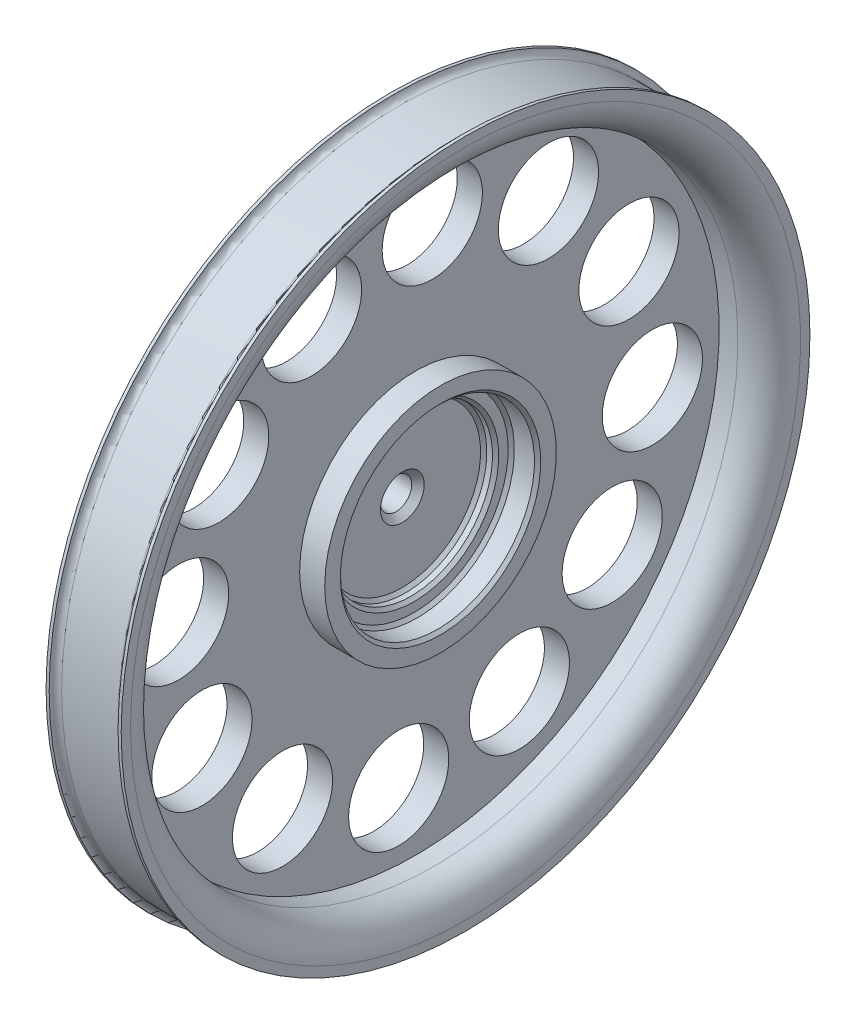
ISO-10303-21;
HEADER;
FILE_DESCRIPTION(('STEP AP214'),'2;1');
FILE_NAME('part.step','',(''),(''),'','','');
FILE_SCHEMA(('AUTOMOTIVE_DESIGN { 1 0 10303 214 1 1 1 1 }'));
ENDSEC;
DATA;
#1=APPLICATION_CONTEXT('core data for automotive mechanical design processes');
#2=APPLICATION_PROTOCOL_DEFINITION('international standard','automotive_design',2000,#1);
#3=PRODUCT_CONTEXT('',#1,'mechanical');
#4=PRODUCT('Part','Part','',(#3));
#5=PRODUCT_RELATED_PRODUCT_CATEGORY('part','',(#4));
#6=PRODUCT_DEFINITION_FORMATION('','',#4);
#7=PRODUCT_DEFINITION_CONTEXT('part definition',#1,'design');
#8=PRODUCT_DEFINITION('design','',#6,#7);
#9=PRODUCT_DEFINITION_SHAPE('','',#8);
#10=(LENGTH_UNIT() NAMED_UNIT(*) SI_UNIT(.MILLI.,.METRE.));
#11=(NAMED_UNIT(*) PLANE_ANGLE_UNIT() SI_UNIT($,.RADIAN.));
#12=(NAMED_UNIT(*) SI_UNIT($,.STERADIAN.) SOLID_ANGLE_UNIT());
#13=UNCERTAINTY_MEASURE_WITH_UNIT(LENGTH_MEASURE(1.E-05),#10,'distance_accuracy_value','');
#14=(GEOMETRIC_REPRESENTATION_CONTEXT(3) GLOBAL_UNCERTAINTY_ASSIGNED_CONTEXT((#13)) GLOBAL_UNIT_ASSIGNED_CONTEXT((#10,
#11,#12)) REPRESENTATION_CONTEXT('',''));
#15=CARTESIAN_POINT('',(0.,0.,0.));
#16=DIRECTION('',(0.,0.,1.));
#17=DIRECTION('',(1.,0.,0.));
#18=AXIS2_PLACEMENT_3D('',#15,#16,#17);
#19=CARTESIAN_POINT('',(-3.99999999999999,-8.9217552513851,0.));
#20=DIRECTION('',(-1.,0.,0.));
#21=DIRECTION('',(0.,0.,1.));
#22=AXIS2_PLACEMENT_3D('',#19,#20,#21);
#23=PLANE('',#22);
#24=CARTESIAN_POINT('',(-3.99999999999999,-27.4217552513851,0.));
#25=DIRECTION('',(-1.,0.,0.));
#26=DIRECTION('',(0.,0.,1.));
#27=AXIS2_PLACEMENT_3D('',#24,#25,#26);
#28=CIRCLE('',#27,16.);
#29=CARTESIAN_POINT('',(-3.99999999999999,-27.4217552513851,16.));
#30=VERTEX_POINT('',#29);
#31=EDGE_CURVE('E10',#30,#30,#28,.T.);
#32=ORIENTED_EDGE('',*,*,#31,.T.);
#33=EDGE_LOOP('',(#32));
#34=FACE_BOUND('',#33,.T.);
#35=CARTESIAN_POINT('',(-4.,-27.4217552513851,0.));
#36=DIRECTION('',(-1.,0.,0.));
#37=DIRECTION('',(0.,0.,1.));
#38=AXIS2_PLACEMENT_3D('',#35,#36,#37);
#39=CIRCLE('',#38,18.5);
#40=CARTESIAN_POINT('',(-4.,-27.4217552513851,18.5));
#41=VERTEX_POINT('',#40);
#42=EDGE_CURVE('E93',#41,#41,#39,.T.);
#43=ORIENTED_EDGE('',*,*,#42,.F.);
#44=EDGE_LOOP('',(#43));
#45=FACE_BOUND('',#44,.T.);
#46=ADVANCED_FACE('F31',(#34,#45),#23,.F.);
#47=CARTESIAN_POINT('',(-20.1,-27.4217552513851,0.));
#48=DIRECTION('',(-1.,0.,0.));
#49=DIRECTION('',(0.,0.,1.));
#50=AXIS2_PLACEMENT_3D('',#47,#48,#49);
#51=CYLINDRICAL_SURFACE('',#50,18.5);
#52=CARTESIAN_POINT('',(-7.99999999999999,-27.4217552513851,0.));
#53=DIRECTION('',(-1.,0.,0.));
#54=DIRECTION('',(0.,0.,1.));
#55=AXIS2_PLACEMENT_3D('',#52,#53,#54);
#56=CIRCLE('',#55,18.5);
#57=CARTESIAN_POINT('',(-7.99999999999999,-27.4217552513851,18.5));
#58=VERTEX_POINT('',#57);
#59=EDGE_CURVE('E96',#58,#58,#56,.T.);
#60=ORIENTED_EDGE('',*,*,#59,.F.);
#61=EDGE_LOOP('',(#60));
#62=FACE_BOUND('',#61,.T.);
#63=ORIENTED_EDGE('',*,*,#42,.T.);
#64=EDGE_LOOP('',(#63));
#65=FACE_BOUND('',#64,.T.);
#66=ADVANCED_FACE('F254',(#62,#65),#51,.T.);
#67=CARTESIAN_POINT('',(-8.,21.0782447486149,0.));
#68=DIRECTION('',(-1.,0.,0.));
#69=DIRECTION('',(0.,0.,1.));
#70=AXIS2_PLACEMENT_3D('',#67,#68,#69);
#71=PLANE('',#70);
#72=CARTESIAN_POINT('',(-8.,-10.8282369676647,-34.1012852833971));
#73=DIRECTION('',(-1.,0.,0.));
#74=DIRECTION('',(0.,0.,1.));
#75=AXIS2_PLACEMENT_3D('',#72,#73,#74);
#76=CIRCLE('',#75,8.);
#77=CARTESIAN_POINT('',(-8.,-10.8282369676647,-26.1012852833971));
#78=VERTEX_POINT('',#77);
#79=EDGE_CURVE('E120',#78,#78,#76,.T.);
#80=ORIENTED_EDGE('',*,*,#79,.T.);
#81=EDGE_LOOP('',(#80));
#82=FACE_BOUND('',#81,.T.);
#83=CARTESIAN_POINT('',(-8.,3.99929576217611,-21.2358202152591));
#84=DIRECTION('',(-1.,0.,0.));
#85=DIRECTION('',(0.,0.,1.));
#86=AXIS2_PLACEMENT_3D('',#83,#84,#85);
#87=CIRCLE('',#86,8.);
#88=CARTESIAN_POINT('',(-8.,3.99929576217611,-13.2358202152592));
#89=VERTEX_POINT('',#88);
#90=EDGE_CURVE('E123',#89,#89,#87,.T.);
#91=ORIENTED_EDGE('',*,*,#90,.T.);
#92=EDGE_LOOP('',(#91));
#93=FACE_BOUND('',#92,.T.);
#94=CARTESIAN_POINT('',(-8.,-30.1019895212211,-37.8293384989855));
#95=DIRECTION('',(-1.,0.,0.));
#96=DIRECTION('',(0.,0.,1.));
#97=AXIS2_PLACEMENT_3D('',#94,#95,#96);
#98=CIRCLE('',#97,7.99999999999999);
#99=CARTESIAN_POINT('',(-8.,-30.1019895212211,-29.8293384989855));
#100=VERTEX_POINT('',#99);
#101=EDGE_CURVE('E126',#100,#100,#98,.T.);
#102=ORIENTED_EDGE('',*,*,#101,.T.);
#103=EDGE_LOOP('',(#102));
#104=FACE_BOUND('',#103,.T.);
#105=CARTESIAN_POINT('',(-8.,-48.6575754666503,-31.4210510135672));
#106=DIRECTION('',(-1.,0.,0.));
#107=DIRECTION('',(0.,0.,1.));
#108=AXIS2_PLACEMENT_3D('',#105,#106,#107);
#109=CIRCLE('',#108,8.);
#110=CARTESIAN_POINT('',(-8.,-48.6575754666503,-23.4210510135672));
#111=VERTEX_POINT('',#110);
#112=EDGE_CURVE('E129',#111,#111,#109,.T.);
#113=ORIENTED_EDGE('',*,*,#112,.T.);
#114=EDGE_LOOP('',(#113));
#115=FACE_BOUND('',#114,.T.);
#116=CARTESIAN_POINT('',(-8.,-61.5230405347883,-16.5935182837264));
#117=DIRECTION('',(-1.,0.,0.));
#118=DIRECTION('',(0.,0.,1.));
#119=AXIS2_PLACEMENT_3D('',#116,#117,#118);
#120=CIRCLE('',#119,8.00000000000001);
#121=CARTESIAN_POINT('',(-8.,-61.5230405347883,-8.59351828372635));
#122=VERTEX_POINT('',#121);
#123=EDGE_CURVE('E132',#122,#122,#120,.T.);
#124=ORIENTED_EDGE('',*,*,#123,.T.);
#125=EDGE_LOOP('',(#124));
#126=FACE_BOUND('',#125,.T.);
#127=CARTESIAN_POINT('',(-8.,-65.2510937503767,2.68023426983001));
#128=DIRECTION('',(-1.,0.,0.));
#129=DIRECTION('',(0.,0.,1.));
#130=AXIS2_PLACEMENT_3D('',#127,#128,#129);
#131=CIRCLE('',#130,8.00000000000001);
#132=CARTESIAN_POINT('',(-8.,-65.2510937503767,10.68023426983));
#133=VERTEX_POINT('',#132);
#134=EDGE_CURVE('E135',#133,#133,#131,.T.);
#135=ORIENTED_EDGE('',*,*,#134,.T.);
#136=EDGE_LOOP('',(#135));
#137=FACE_BOUND('',#136,.T.);
#138=CARTESIAN_POINT('',(-8.,-44.0152735351175,34.1012852833972));
#139=DIRECTION('',(-1.,0.,0.));
#140=DIRECTION('',(0.,0.,1.));
#141=AXIS2_PLACEMENT_3D('',#138,#139,#140);
#142=CIRCLE('',#141,8.);
#143=CARTESIAN_POINT('',(-8.,-44.0152735351175,42.1012852833972));
#144=VERTEX_POINT('',#143);
#145=EDGE_CURVE('E138',#144,#144,#142,.T.);
#146=ORIENTED_EDGE('',*,*,#145,.T.);
#147=EDGE_LOOP('',(#146));
#148=FACE_BOUND('',#147,.T.);
#149=CARTESIAN_POINT('',(-8.,-58.8428062649583,21.2358202152592));
#150=DIRECTION('',(-1.,0.,0.));
#151=DIRECTION('',(0.,0.,1.));
#152=AXIS2_PLACEMENT_3D('',#149,#150,#151);
#153=CIRCLE('',#152,8.);
#154=CARTESIAN_POINT('',(-8.,-58.8428062649583,29.2358202152592));
#155=VERTEX_POINT('',#154);
#156=EDGE_CURVE('E141',#155,#155,#153,.T.);
#157=ORIENTED_EDGE('',*,*,#156,.T.);
#158=EDGE_LOOP('',(#157));
#159=FACE_BOUND('',#158,.T.);
#160=CARTESIAN_POINT('',(-8.,-6.1859350361319,31.4210510135672));
#161=DIRECTION('',(-1.,0.,0.));
#162=DIRECTION('',(0.,0.,1.));
#163=AXIS2_PLACEMENT_3D('',#160,#161,#162);
#164=CIRCLE('',#163,7.99999999999998);
#165=CARTESIAN_POINT('',(-8.,-6.1859350361319,39.4210510135672));
#166=VERTEX_POINT('',#165);
#167=EDGE_CURVE('E144',#166,#166,#164,.T.);
#168=ORIENTED_EDGE('',*,*,#167,.T.);
#169=EDGE_LOOP('',(#168));
#170=FACE_BOUND('',#169,.T.);
#171=CARTESIAN_POINT('',(-8.,6.6795300320061,16.5935182837264));
#172=DIRECTION('',(-1.,0.,0.));
#173=DIRECTION('',(0.,0.,1.));
#174=AXIS2_PLACEMENT_3D('',#171,#172,#173);
#175=CIRCLE('',#174,8.);
#176=CARTESIAN_POINT('',(-8.,6.6795300320061,24.5935182837264));
#177=VERTEX_POINT('',#176);
#178=EDGE_CURVE('E147',#177,#177,#175,.T.);
#179=ORIENTED_EDGE('',*,*,#178,.T.);
#180=EDGE_LOOP('',(#179));
#181=FACE_BOUND('',#180,.T.);
#182=CARTESIAN_POINT('',(-8.,10.4075832475945,-2.68023426982993));
#183=DIRECTION('',(-1.,0.,0.));
#184=DIRECTION('',(0.,0.,1.));
#185=AXIS2_PLACEMENT_3D('',#182,#183,#184);
#186=CIRCLE('',#185,8.);
#187=CARTESIAN_POINT('',(-8.,10.4075832475945,5.31976573017007));
#188=VERTEX_POINT('',#187);
#189=EDGE_CURVE('E150',#188,#188,#186,.T.);
#190=ORIENTED_EDGE('',*,*,#189,.T.);
#191=EDGE_LOOP('',(#190));
#192=FACE_BOUND('',#191,.T.);
#193=CARTESIAN_POINT('',(-8.,-24.7415209815611,37.8293384989856));
#194=DIRECTION('',(-1.,0.,0.));
#195=DIRECTION('',(0.,0.,1.));
#196=AXIS2_PLACEMENT_3D('',#193,#194,#195);
#197=CIRCLE('',#196,8.);
#198=CARTESIAN_POINT('',(-8.,-24.7415209815611,45.8293384989856));
#199=VERTEX_POINT('',#198);
#200=EDGE_CURVE('E153',#199,#199,#197,.T.);
#201=ORIENTED_EDGE('',*,*,#200,.T.);
#202=EDGE_LOOP('',(#201));
#203=FACE_BOUND('',#202,.T.);
#204=CARTESIAN_POINT('',(-8.,-27.4217552513851,0.));
#205=DIRECTION('',(-1.,0.,0.));
#206=DIRECTION('',(0.,0.,1.));
#207=AXIS2_PLACEMENT_3D('',#204,#205,#206);
#208=CIRCLE('',#207,48.5);
#209=CARTESIAN_POINT('',(-8.,-27.4217552513851,48.5));
#210=VERTEX_POINT('',#209);
#211=EDGE_CURVE('E99',#210,#210,#208,.T.);
#212=ORIENTED_EDGE('',*,*,#211,.F.);
#213=EDGE_LOOP('',(#212));
#214=FACE_BOUND('',#213,.T.);
#215=ORIENTED_EDGE('',*,*,#59,.T.);
#216=EDGE_LOOP('',(#215));
#217=FACE_BOUND('',#216,.T.);
#218=ADVANCED_FACE('F250',(#82,#93,#104,#115,#126,#137,#148,#159,#170,#181,#192,#203,#214,#217),
#71,.F.);
#219=CARTESIAN_POINT('',(-20.1,-27.4217552513851,0.));
#220=DIRECTION('',(-1.,0.,0.));
#221=DIRECTION('',(0.,0.,1.));
#222=AXIS2_PLACEMENT_3D('',#219,#220,#221);
#223=CYLINDRICAL_SURFACE('',#222,48.5);
#224=CARTESIAN_POINT('',(-5.,-27.4217552513851,0.));
#225=DIRECTION('',(-1.,0.,0.));
#226=DIRECTION('',(0.,0.,1.));
#227=AXIS2_PLACEMENT_3D('',#224,#225,#226);
#228=CIRCLE('',#227,48.5);
#229=CARTESIAN_POINT('',(-5.,-27.4217552513851,48.5));
#230=VERTEX_POINT('',#229);
#231=EDGE_CURVE('E75',#230,#230,#228,.F.);
#232=ORIENTED_EDGE('',*,*,#231,.T.);
#233=EDGE_LOOP('',(#232));
#234=FACE_BOUND('',#233,.T.);
#235=ORIENTED_EDGE('',*,*,#211,.T.);
#236=EDGE_LOOP('',(#235));
#237=FACE_BOUND('',#236,.T.);
#238=ADVANCED_FACE('F244',(#234,#237),#223,.F.);
#239=CARTESIAN_POINT('',(0.,27.5782447486149,0.));
#240=DIRECTION('',(-1.,0.,0.));
#241=DIRECTION('',(0.,0.,1.));
#242=AXIS2_PLACEMENT_3D('',#239,#240,#241);
#243=PLANE('',#242);
#244=CARTESIAN_POINT('',(0.,-27.4217552513851,0.));
#245=DIRECTION('',(-1.,0.,0.));
#246=DIRECTION('',(0.,0.,1.));
#247=AXIS2_PLACEMENT_3D('',#244,#245,#246);
#248=CIRCLE('',#247,53.5);
#249=CARTESIAN_POINT('',(0.,-27.4217552513851,53.5));
#250=VERTEX_POINT('',#249);
#251=EDGE_CURVE('E78',#250,#250,#248,.T.);
#252=ORIENTED_EDGE('',*,*,#251,.T.);
#253=EDGE_LOOP('',(#252));
#254=FACE_BOUND('',#253,.T.);
#255=CARTESIAN_POINT('',(0.,-27.4217552513851,0.));
#256=DIRECTION('',(-1.,0.,0.));
#257=DIRECTION('',(0.,0.,1.));
#258=AXIS2_PLACEMENT_3D('',#255,#256,#257);
#259=CIRCLE('',#258,55.);
#260=CARTESIAN_POINT('',(0.,-27.4217552513851,55.));
#261=VERTEX_POINT('',#260);
#262=EDGE_CURVE('E102',#261,#261,#259,.T.);
#263=ORIENTED_EDGE('',*,*,#262,.F.);
#264=EDGE_LOOP('',(#263));
#265=FACE_BOUND('',#264,.T.);
#266=ADVANCED_FACE('F239',(#254,#265),#243,.F.);
#267=CARTESIAN_POINT('',(-20.1,-27.4217552513851,0.));
#268=DIRECTION('',(-1.,0.,0.));
#269=DIRECTION('',(0.,0.,1.));
#270=AXIS2_PLACEMENT_3D('',#267,#268,#269);
#271=CYLINDRICAL_SURFACE('',#270,55.);
#272=CARTESIAN_POINT('',(-0.5,-27.4217552513851,0.));
#273=DIRECTION('',(-1.,0.,0.));
#274=DIRECTION('',(0.,0.,1.));
#275=AXIS2_PLACEMENT_3D('',#272,#273,#274);
#276=CIRCLE('',#275,55.);
#277=CARTESIAN_POINT('',(-0.5,-27.4217552513851,55.));
#278=VERTEX_POINT('',#277);
#279=EDGE_CURVE('E105',#278,#278,#276,.T.);
#280=ORIENTED_EDGE('',*,*,#279,.F.);
#281=EDGE_LOOP('',(#280));
#282=FACE_BOUND('',#281,.T.);
#283=ORIENTED_EDGE('',*,*,#262,.T.);
#284=EDGE_LOOP('',(#283));
#285=FACE_BOUND('',#284,.T.);
#286=ADVANCED_FACE('F233',(#282,#285),#271,.T.);
#287=CARTESIAN_POINT('',(-1.49999621102573,-27.4217552513851,0.));
#288=DIRECTION('',(-1.,0.,0.));
#289=DIRECTION('',(0.,0.,1.));
#290=AXIS2_PLACEMENT_3D('',#287,#288,#289);
#291=TOROIDAL_SURFACE('',#290,55.0027528047848,1.);
#292=CARTESIAN_POINT('',(-1.49895959557697,-27.4217552513851,0.));
#293=DIRECTION('',(-1.,0.,0.));
#294=DIRECTION('',(0.,0.,1.));
#295=AXIS2_PLACEMENT_3D('',#292,#293,#294);
#296=CIRCLE('',#295,54.0027533420708);
#297=CARTESIAN_POINT('',(-1.49895959557697,-27.4217552513851,54.0027533420708));
#298=VERTEX_POINT('',#297);
#299=EDGE_CURVE('E108',#298,#298,#296,.T.);
#300=ORIENTED_EDGE('',*,*,#299,.F.);
#301=EDGE_LOOP('',(#300));
#302=FACE_BOUND('',#301,.T.);
#303=ORIENTED_EDGE('',*,*,#279,.T.);
#304=EDGE_LOOP('',(#303));
#305=FACE_BOUND('',#304,.T.);
#306=ADVANCED_FACE('F227',(#302,#305),#291,.F.);
#307=CARTESIAN_POINT('',(-20.1,-27.4217552513851,0.));
#308=DIRECTION('',(-1.,0.,0.));
#309=DIRECTION('',(0.,0.,1.));
#310=AXIS2_PLACEMENT_3D('',#307,#308,#309);
#311=CYLINDRICAL_SURFACE('',#310,54.0027533420708);
#312=CARTESIAN_POINT('',(-10.5048742847296,-27.4217552513851,0.));
#313=DIRECTION('',(-1.,0.,0.));
#314=DIRECTION('',(0.,0.,1.));
#315=AXIS2_PLACEMENT_3D('',#312,#313,#314);
#316=CIRCLE('',#315,54.0027533420708);
#317=CARTESIAN_POINT('',(-10.5048742847296,-27.4217552513851,54.0027533420708));
#318=VERTEX_POINT('',#317);
#319=EDGE_CURVE('E111',#318,#318,#316,.T.);
#320=ORIENTED_EDGE('',*,*,#319,.F.);
#321=EDGE_LOOP('',(#320));
#322=FACE_BOUND('',#321,.T.);
#323=ORIENTED_EDGE('',*,*,#299,.T.);
#324=EDGE_LOOP('',(#323));
#325=FACE_BOUND('',#324,.T.);
#326=ADVANCED_FACE('F221',(#322,#325),#311,.T.);
#327=CARTESIAN_POINT('',(-10.5000037578661,-27.4217552513851,0.));
#328=DIRECTION('',(-1.,0.,0.));
#329=DIRECTION('',(0.,0.,1.));
#330=AXIS2_PLACEMENT_3D('',#327,#328,#329);
#331=TOROIDAL_SURFACE('',#330,55.0027414809845,1.);
#332=CARTESIAN_POINT('',(-11.5,-27.4217552513851,0.));
#333=DIRECTION('',(-1.,0.,0.));
#334=DIRECTION('',(0.,0.,1.));
#335=AXIS2_PLACEMENT_3D('',#332,#333,#334);
#336=CIRCLE('',#335,55.);
#337=CARTESIAN_POINT('',(-11.5,-27.4217552513851,55.));
#338=VERTEX_POINT('',#337);
#339=EDGE_CURVE('E114',#338,#338,#336,.T.);
#340=ORIENTED_EDGE('',*,*,#339,.F.);
#341=EDGE_LOOP('',(#340));
#342=FACE_BOUND('',#341,.T.);
#343=ORIENTED_EDGE('',*,*,#319,.T.);
#344=EDGE_LOOP('',(#343));
#345=FACE_BOUND('',#344,.T.);
#346=ADVANCED_FACE('F215',(#342,#345),#331,.F.);
#347=CARTESIAN_POINT('',(-20.1,-27.4217552513851,0.));
#348=DIRECTION('',(-1.,0.,0.));
#349=DIRECTION('',(0.,0.,1.));
#350=AXIS2_PLACEMENT_3D('',#347,#348,#349);
#351=CYLINDRICAL_SURFACE('',#350,55.);
#352=CARTESIAN_POINT('',(-12.,-27.4217552513851,0.));
#353=DIRECTION('',(-1.,0.,0.));
#354=DIRECTION('',(0.,0.,1.));
#355=AXIS2_PLACEMENT_3D('',#352,#353,#354);
#356=CIRCLE('',#355,55.);
#357=CARTESIAN_POINT('',(-12.,-27.4217552513851,55.));
#358=VERTEX_POINT('',#357);
#359=EDGE_CURVE('E117',#358,#358,#356,.T.);
#360=ORIENTED_EDGE('',*,*,#359,.F.);
#361=EDGE_LOOP('',(#360));
#362=FACE_BOUND('',#361,.T.);
#363=ORIENTED_EDGE('',*,*,#339,.T.);
#364=EDGE_LOOP('',(#363));
#365=FACE_BOUND('',#364,.T.);
#366=ADVANCED_FACE('F200',(#362,#365),#351,.T.);
#367=CARTESIAN_POINT('',(-12.,27.5782447486149,0.));
#368=DIRECTION('',(1.,0.,0.));
#369=DIRECTION('',(0.,0.,-1.));
#370=AXIS2_PLACEMENT_3D('',#367,#368,#369);
#371=PLANE('',#370);
#372=CARTESIAN_POINT('',(-12.,-10.8282369676647,-34.1012852833971));
#373=DIRECTION('',(-1.,0.,0.));
#374=DIRECTION('',(0.,0.,1.));
#375=AXIS2_PLACEMENT_3D('',#372,#373,#374);
#376=CIRCLE('',#375,8.);
#377=CARTESIAN_POINT('',(-12.,-10.8282369676647,-26.1012852833971));
#378=VERTEX_POINT('',#377);
#379=EDGE_CURVE('E172',#378,#378,#376,.T.);
#380=ORIENTED_EDGE('',*,*,#379,.F.);
#381=EDGE_LOOP('',(#380));
#382=FACE_BOUND('',#381,.T.);
#383=CARTESIAN_POINT('',(-12.,3.99929576217611,-21.2358202152591));
#384=DIRECTION('',(-1.,0.,0.));
#385=DIRECTION('',(0.,0.,1.));
#386=AXIS2_PLACEMENT_3D('',#383,#384,#385);
#387=CIRCLE('',#386,8.);
#388=CARTESIAN_POINT('',(-12.,3.99929576217611,-13.2358202152592));
#389=VERTEX_POINT('',#388);
#390=EDGE_CURVE('E176',#389,#389,#387,.T.);
#391=ORIENTED_EDGE('',*,*,#390,.F.);
#392=EDGE_LOOP('',(#391));
#393=FACE_BOUND('',#392,.T.);
#394=CARTESIAN_POINT('',(-12.,-30.1019895212211,-37.8293384989855));
#395=DIRECTION('',(-1.,0.,0.));
#396=DIRECTION('',(0.,0.,1.));
#397=AXIS2_PLACEMENT_3D('',#394,#395,#396);
#398=CIRCLE('',#397,7.99999999999999);
#399=CARTESIAN_POINT('',(-12.,-30.1019895212211,-29.8293384989855));
#400=VERTEX_POINT('',#399);
#401=EDGE_CURVE('E175',#400,#400,#398,.T.);
#402=ORIENTED_EDGE('',*,*,#401,.F.);
#403=EDGE_LOOP('',(#402));
#404=FACE_BOUND('',#403,.T.);
#405=CARTESIAN_POINT('',(-12.,-48.6575754666503,-31.4210510135672));
#406=DIRECTION('',(-1.,0.,0.));
#407=DIRECTION('',(0.,0.,1.));
#408=AXIS2_PLACEMENT_3D('',#405,#406,#407);
#409=CIRCLE('',#408,8.);
#410=CARTESIAN_POINT('',(-12.,-48.6575754666503,-23.4210510135672));
#411=VERTEX_POINT('',#410);
#412=EDGE_CURVE('E164',#411,#411,#409,.T.);
#413=ORIENTED_EDGE('',*,*,#412,.F.);
#414=EDGE_LOOP('',(#413));
#415=FACE_BOUND('',#414,.T.);
#416=CARTESIAN_POINT('',(-12.,-61.5230405347883,-16.5935182837264));
#417=DIRECTION('',(-1.,0.,0.));
#418=DIRECTION('',(0.,0.,1.));
#419=AXIS2_PLACEMENT_3D('',#416,#417,#418);
#420=CIRCLE('',#419,8.00000000000001);
#421=CARTESIAN_POINT('',(-12.,-61.5230405347883,-8.59351828372635));
#422=VERTEX_POINT('',#421);
#423=EDGE_CURVE('E160',#422,#422,#420,.T.);
#424=ORIENTED_EDGE('',*,*,#423,.F.);
#425=EDGE_LOOP('',(#424));
#426=FACE_BOUND('',#425,.T.);
#427=CARTESIAN_POINT('',(-12.,-65.2510937503767,2.68023426983001));
#428=DIRECTION('',(-1.,0.,0.));
#429=DIRECTION('',(0.,0.,1.));
#430=AXIS2_PLACEMENT_3D('',#427,#428,#429);
#431=CIRCLE('',#430,8.00000000000001);
#432=CARTESIAN_POINT('',(-12.,-65.2510937503767,10.68023426983));
#433=VERTEX_POINT('',#432);
#434=EDGE_CURVE('E163',#433,#433,#431,.T.);
#435=ORIENTED_EDGE('',*,*,#434,.F.);
#436=EDGE_LOOP('',(#435));
#437=FACE_BOUND('',#436,.T.);
#438=CARTESIAN_POINT('',(-12.,-44.0152735351175,34.1012852833972));
#439=DIRECTION('',(-1.,0.,0.));
#440=DIRECTION('',(0.,0.,1.));
#441=AXIS2_PLACEMENT_3D('',#438,#439,#440);
#442=CIRCLE('',#441,8.);
#443=CARTESIAN_POINT('',(-12.,-44.0152735351175,42.1012852833972));
#444=VERTEX_POINT('',#443);
#445=EDGE_CURVE('E159',#444,#444,#442,.T.);
#446=ORIENTED_EDGE('',*,*,#445,.F.);
#447=EDGE_LOOP('',(#446));
#448=FACE_BOUND('',#447,.T.);
#449=CARTESIAN_POINT('',(-12.,-58.8428062649583,21.2358202152592));
#450=DIRECTION('',(-1.,0.,0.));
#451=DIRECTION('',(0.,0.,1.));
#452=AXIS2_PLACEMENT_3D('',#449,#450,#451);
#453=CIRCLE('',#452,8.);
#454=CARTESIAN_POINT('',(-12.,-58.8428062649583,29.2358202152592));
#455=VERTEX_POINT('',#454);
#456=EDGE_CURVE('E167',#455,#455,#453,.T.);
#457=ORIENTED_EDGE('',*,*,#456,.F.);
#458=EDGE_LOOP('',(#457));
#459=FACE_BOUND('',#458,.T.);
#460=CARTESIAN_POINT('',(-12.,-6.1859350361319,31.4210510135672));
#461=DIRECTION('',(-1.,0.,0.));
#462=DIRECTION('',(0.,0.,1.));
#463=AXIS2_PLACEMENT_3D('',#460,#461,#462);
#464=CIRCLE('',#463,7.99999999999998);
#465=CARTESIAN_POINT('',(-12.,-6.1859350361319,39.4210510135672));
#466=VERTEX_POINT('',#465);
#467=EDGE_CURVE('E187',#466,#466,#464,.T.);
#468=ORIENTED_EDGE('',*,*,#467,.F.);
#469=EDGE_LOOP('',(#468));
#470=FACE_BOUND('',#469,.T.);
#471=CARTESIAN_POINT('',(-12.,6.6795300320061,16.5935182837264));
#472=DIRECTION('',(-1.,0.,0.));
#473=DIRECTION('',(0.,0.,1.));
#474=AXIS2_PLACEMENT_3D('',#471,#472,#473);
#475=CIRCLE('',#474,8.);
#476=CARTESIAN_POINT('',(-12.,6.6795300320061,24.5935182837264));
#477=VERTEX_POINT('',#476);
#478=EDGE_CURVE('E184',#477,#477,#475,.T.);
#479=ORIENTED_EDGE('',*,*,#478,.F.);
#480=EDGE_LOOP('',(#479));
#481=FACE_BOUND('',#480,.T.);
#482=CARTESIAN_POINT('',(-12.,10.4075832475945,-2.68023426982993));
#483=DIRECTION('',(-1.,0.,0.));
#484=DIRECTION('',(0.,0.,1.));
#485=AXIS2_PLACEMENT_3D('',#482,#483,#484);
#486=CIRCLE('',#485,8.);
#487=CARTESIAN_POINT('',(-12.,10.4075832475945,5.31976573017007));
#488=VERTEX_POINT('',#487);
#489=EDGE_CURVE('E179',#488,#488,#486,.T.);
#490=ORIENTED_EDGE('',*,*,#489,.F.);
#491=EDGE_LOOP('',(#490));
#492=FACE_BOUND('',#491,.T.);
#493=CARTESIAN_POINT('',(-12.,-24.7415209815611,37.8293384989856));
#494=DIRECTION('',(-1.,0.,0.));
#495=DIRECTION('',(0.,0.,1.));
#496=AXIS2_PLACEMENT_3D('',#493,#494,#495);
#497=CIRCLE('',#496,8.);
#498=CARTESIAN_POINT('',(-12.,-24.7415209815611,45.8293384989856));
#499=VERTEX_POINT('',#498);
#500=EDGE_CURVE('E156',#499,#499,#497,.T.);
#501=ORIENTED_EDGE('',*,*,#500,.F.);
#502=EDGE_LOOP('',(#501));
#503=FACE_BOUND('',#502,.T.);
#504=CARTESIAN_POINT('',(-12.,-27.4217552513851,0.));
#505=DIRECTION('',(1.,0.,0.));
#506=DIRECTION('',(0.,0.,-1.));
#507=AXIS2_PLACEMENT_3D('',#504,#505,#506);
#508=CIRCLE('',#507,26.8564855607095);
#509=CARTESIAN_POINT('',(-12.,-27.4217552513851,-26.8564855607095));
#510=VERTEX_POINT('',#509);
#511=EDGE_CURVE('E84',#510,#510,#508,.T.);
#512=ORIENTED_EDGE('',*,*,#511,.T.);
#513=EDGE_LOOP('',(#512));
#514=FACE_BOUND('',#513,.T.);
#515=ORIENTED_EDGE('',*,*,#359,.T.);
#516=EDGE_LOOP('',(#515));
#517=FACE_BOUND('',#516,.T.);
#518=ADVANCED_FACE('F196',(#382,#393,#404,#415,#426,#437,#448,#459,#470,#481,#492,#503,#514,
#517),#371,.F.);
#519=CARTESIAN_POINT('',(-12.,-27.4217552513851,0.));
#520=DIRECTION('',(1.,0.,0.));
#521=DIRECTION('',(0.,0.,-1.));
#522=AXIS2_PLACEMENT_3D('',#519,#520,#521);
#523=CONICAL_SURFACE('',#522,23.4293117322557,0.910451746215589);
#524=CARTESIAN_POINT('',(-14.1021908355866,-27.4217552513851,0.));
#525=DIRECTION('',(1.,0.,0.));
#526=DIRECTION('',(0.,0.,-1.));
#527=AXIS2_PLACEMENT_3D('',#524,#525,#526);
#528=CIRCLE('',#527,20.7225952452158);
#529=CARTESIAN_POINT('',(-14.1021908355866,-27.4217552513851,-20.7225952452158));
#530=VERTEX_POINT('',#529);
#531=EDGE_CURVE('E87',#530,#530,#528,.F.);
#532=ORIENTED_EDGE('',*,*,#531,.T.);
#533=EDGE_LOOP('',(#532));
#534=FACE_BOUND('',#533,.T.);
#535=CARTESIAN_POINT('',(-17.9978091644134,-27.4217552513851,0.));
#536=DIRECTION('',(-1.,0.,0.));
#537=DIRECTION('',(0.,0.,1.));
#538=AXIS2_PLACEMENT_3D('',#535,#536,#537);
#539=CIRCLE('',#538,15.70671648704);
#540=CARTESIAN_POINT('',(-17.9978091644134,-27.4217552513851,15.70671648704));
#541=VERTEX_POINT('',#540);
#542=EDGE_CURVE('E90',#541,#541,#539,.F.);
#543=ORIENTED_EDGE('',*,*,#542,.T.);
#544=EDGE_LOOP('',(#543));
#545=FACE_BOUND('',#544,.T.);
#546=ADVANCED_FACE('F199',(#534,#545),#523,.T.);
#547=CARTESIAN_POINT('',(-20.1,-14.4217552513851,0.));
#548=DIRECTION('',(1.,0.,0.));
#549=DIRECTION('',(0.,0.,-1.));
#550=AXIS2_PLACEMENT_3D('',#547,#548,#549);
#551=PLANE('',#550);
#552=CARTESIAN_POINT('',(-20.1,-27.4217552513851,0.));
#553=DIRECTION('',(1.,0.,0.));
#554=DIRECTION('',(0.,0.,-1.));
#555=AXIS2_PLACEMENT_3D('',#552,#553,#554);
#556=CIRCLE('',#555,3.50000000000002);
#557=CARTESIAN_POINT('',(-20.1,-27.4217552513851,-3.50000000000002));
#558=VERTEX_POINT('',#557);
#559=EDGE_CURVE('E63',#558,#558,#556,.T.);
#560=ORIENTED_EDGE('',*,*,#559,.T.);
#561=EDGE_LOOP('',(#560));
#562=FACE_BOUND('',#561,.T.);
#563=CARTESIAN_POINT('',(-20.1,-27.4217552513851,0.));
#564=DIRECTION('',(1.,0.,0.));
#565=DIRECTION('',(0.,0.,-1.));
#566=AXIS2_PLACEMENT_3D('',#563,#564,#565);
#567=CIRCLE('',#566,9.57282617154625);
#568=CARTESIAN_POINT('',(-20.1,-27.4217552513851,-9.57282617154625));
#569=VERTEX_POINT('',#568);
#570=EDGE_CURVE('E81',#569,#569,#567,.F.);
#571=ORIENTED_EDGE('',*,*,#570,.T.);
#572=EDGE_LOOP('',(#571));
#573=FACE_BOUND('',#572,.T.);
#574=ADVANCED_FACE('F326',(#562,#573),#551,.F.);
#575=CARTESIAN_POINT('',(-10.1,-27.4217552513851,0.));
#576=DIRECTION('',(-1.,0.,0.));
#577=DIRECTION('',(0.,0.,1.));
#578=AXIS2_PLACEMENT_3D('',#575,#576,#577);
#579=PLANE('',#578);
#580=CARTESIAN_POINT('',(-10.1,-27.4217552513851,0.));
#581=DIRECTION('',(-1.,0.,0.));
#582=DIRECTION('',(0.,0.,1.));
#583=AXIS2_PLACEMENT_3D('',#580,#581,#582);
#584=CIRCLE('',#583,12.5);
#585=CARTESIAN_POINT('',(-10.1,-27.4217552513851,12.5));
#586=VERTEX_POINT('',#585);
#587=EDGE_CURVE('E54',#586,#586,#584,.F.);
#588=ORIENTED_EDGE('',*,*,#587,.T.);
#589=EDGE_LOOP('',(#588));
#590=FACE_BOUND('',#589,.T.);
#591=CARTESIAN_POINT('',(-10.1,-27.4217552513851,0.));
#592=DIRECTION('',(-1.,0.,0.));
#593=DIRECTION('',(0.,0.,1.));
#594=AXIS2_PLACEMENT_3D('',#591,#592,#593);
#595=CIRCLE('',#594,3.5);
#596=CARTESIAN_POINT('',(-10.1,-27.4217552513851,3.5));
#597=VERTEX_POINT('',#596);
#598=EDGE_CURVE('E72',#597,#597,#595,.T.);
#599=ORIENTED_EDGE('',*,*,#598,.T.);
#600=EDGE_LOOP('',(#599));
#601=FACE_BOUND('',#600,.T.);
#602=ADVANCED_FACE('F322',(#590,#601),#579,.F.);
#603=CARTESIAN_POINT('',(-20.1,-27.4217552513851,0.));
#604=DIRECTION('',(-1.,0.,0.));
#605=DIRECTION('',(0.,0.,1.));
#606=AXIS2_PLACEMENT_3D('',#603,#604,#605);
#607=CYLINDRICAL_SURFACE('',#606,13.);
#608=CARTESIAN_POINT('',(-9.59999999999998,-27.4217552513851,0.));
#609=DIRECTION('',(-1.,0.,0.));
#610=DIRECTION('',(0.,0.,1.));
#611=AXIS2_PLACEMENT_3D('',#608,#609,#610);
#612=CIRCLE('',#611,13.);
#613=CARTESIAN_POINT('',(-9.59999999999998,-27.4217552513851,13.));
#614=VERTEX_POINT('',#613);
#615=EDGE_CURVE('E57',#614,#614,#612,.T.);
#616=ORIENTED_EDGE('',*,*,#615,.T.);
#617=EDGE_LOOP('',(#616));
#618=FACE_BOUND('',#617,.T.);
#619=CARTESIAN_POINT('',(-8.69999999999999,-27.4217552513851,0.));
#620=DIRECTION('',(-1.,0.,0.));
#621=DIRECTION('',(0.,0.,1.));
#622=AXIS2_PLACEMENT_3D('',#619,#620,#621);
#623=CIRCLE('',#622,13.);
#624=CARTESIAN_POINT('',(-8.69999999999999,-27.4217552513851,13.));
#625=VERTEX_POINT('',#624);
#626=EDGE_CURVE('E60',#625,#625,#623,.F.);
#627=ORIENTED_EDGE('',*,*,#626,.T.);
#628=EDGE_LOOP('',(#627));
#629=FACE_BOUND('',#628,.T.);
#630=ADVANCED_FACE('F316',(#618,#629),#607,.F.);
#631=CARTESIAN_POINT('',(-8.2,-14.4217552513851,0.));
#632=DIRECTION('',(-1.,0.,0.));
#633=DIRECTION('',(0.,0.,1.));
#634=AXIS2_PLACEMENT_3D('',#631,#632,#633);
#635=PLANE('',#634);
#636=CARTESIAN_POINT('',(-8.2,-27.4217552513851,0.));
#637=DIRECTION('',(-1.,0.,0.));
#638=DIRECTION('',(0.,0.,1.));
#639=AXIS2_PLACEMENT_3D('',#636,#637,#638);
#640=CIRCLE('',#639,15.);
#641=CARTESIAN_POINT('',(-8.2,-27.4217552513851,15.));
#642=VERTEX_POINT('',#641);
#643=EDGE_CURVE('E38',#642,#642,#640,.F.);
#644=ORIENTED_EDGE('',*,*,#643,.T.);
#645=EDGE_LOOP('',(#644));
#646=FACE_BOUND('',#645,.T.);
#647=CARTESIAN_POINT('',(-8.2,-27.4217552513851,0.));
#648=DIRECTION('',(-1.,0.,0.));
#649=DIRECTION('',(0.,0.,1.));
#650=AXIS2_PLACEMENT_3D('',#647,#648,#649);
#651=CIRCLE('',#650,13.5);
#652=CARTESIAN_POINT('',(-8.2,-27.4217552513851,13.5));
#653=VERTEX_POINT('',#652);
#654=EDGE_CURVE('E51',#653,#653,#651,.T.);
#655=ORIENTED_EDGE('',*,*,#654,.T.);
#656=EDGE_LOOP('',(#655));
#657=FACE_BOUND('',#656,.T.);
#658=ADVANCED_FACE('F306',(#646,#657),#635,.F.);
#659=CARTESIAN_POINT('',(-20.1,-27.4217552513851,0.));
#660=DIRECTION('',(-1.,0.,0.));
#661=DIRECTION('',(0.,0.,1.));
#662=AXIS2_PLACEMENT_3D('',#659,#660,#661);
#663=CYLINDRICAL_SURFACE('',#662,15.5);
#664=CARTESIAN_POINT('',(-7.69999999999999,-27.4217552513851,0.));
#665=DIRECTION('',(-1.,0.,0.));
#666=DIRECTION('',(0.,0.,1.));
#667=AXIS2_PLACEMENT_3D('',#664,#665,#666);
#668=CIRCLE('',#667,15.5);
#669=CARTESIAN_POINT('',(-7.69999999999999,-27.4217552513851,15.5));
#670=VERTEX_POINT('',#669);
#671=EDGE_CURVE('E42',#670,#670,#668,.T.);
#672=ORIENTED_EDGE('',*,*,#671,.T.);
#673=EDGE_LOOP('',(#672));
#674=FACE_BOUND('',#673,.T.);
#675=CARTESIAN_POINT('',(-4.50000000000001,-27.4217552513851,0.));
#676=DIRECTION('',(-1.,0.,0.));
#677=DIRECTION('',(0.,0.,1.));
#678=AXIS2_PLACEMENT_3D('',#675,#676,#677);
#679=CIRCLE('',#678,15.5);
#680=CARTESIAN_POINT('',(-4.50000000000001,-27.4217552513851,15.5));
#681=VERTEX_POINT('',#680);
#682=EDGE_CURVE('E46',#681,#681,#679,.F.);
#683=ORIENTED_EDGE('',*,*,#682,.T.);
#684=EDGE_LOOP('',(#683));
#685=FACE_BOUND('',#684,.T.);
#686=ADVANCED_FACE('F303',(#674,#685),#663,.F.);
#687=CARTESIAN_POINT('',(0.,-27.4217552513851,0.));
#688=DIRECTION('',(-1.,0.,0.));
#689=DIRECTION('',(0.,0.,1.));
#690=AXIS2_PLACEMENT_3D('',#687,#688,#689);
#691=CYLINDRICAL_SURFACE('',#690,2.5);
#692=CARTESIAN_POINT('',(-11.1,-27.4217552513851,0.));
#693=DIRECTION('',(-1.,0.,0.));
#694=DIRECTION('',(0.,0.,1.));
#695=AXIS2_PLACEMENT_3D('',#692,#693,#694);
#696=CIRCLE('',#695,2.5);
#697=CARTESIAN_POINT('',(-11.1,-27.4217552513851,2.5));
#698=VERTEX_POINT('',#697);
#699=EDGE_CURVE('E66',#698,#698,#696,.F.);
#700=ORIENTED_EDGE('',*,*,#699,.T.);
#701=EDGE_LOOP('',(#700));
#702=FACE_BOUND('',#701,.T.);
#703=CARTESIAN_POINT('',(-19.1,-27.4217552513851,0.));
#704=DIRECTION('',(1.,0.,0.));
#705=DIRECTION('',(0.,0.,-1.));
#706=AXIS2_PLACEMENT_3D('',#703,#704,#705);
#707=CIRCLE('',#706,2.5);
#708=CARTESIAN_POINT('',(-19.1,-27.4217552513851,-2.5));
#709=VERTEX_POINT('',#708);
#710=EDGE_CURVE('E69',#709,#709,#707,.F.);
#711=ORIENTED_EDGE('',*,*,#710,.T.);
#712=EDGE_LOOP('',(#711));
#713=FACE_BOUND('',#712,.T.);
#714=ADVANCED_FACE('F268',(#702,#713),#691,.F.);
#715=CARTESIAN_POINT('',(-22.,-27.4217552513851,0.));
#716=DIRECTION('',(1.,0.,0.));
#717=DIRECTION('',(0.,0.,-1.));
#718=AXIS2_PLACEMENT_3D('',#715,#716,#717);
#719=TOROIDAL_SURFACE('',#718,26.8564855607095,10.);
#720=ORIENTED_EDGE('',*,*,#511,.F.);
#721=EDGE_LOOP('',(#720));
#722=FACE_BOUND('',#721,.T.);
#723=ORIENTED_EDGE('',*,*,#531,.F.);
#724=EDGE_LOOP('',(#723));
#725=FACE_BOUND('',#724,.T.);
#726=ADVANCED_FACE('F264',(#722,#725),#719,.F.);
#727=CARTESIAN_POINT('',(-10.1,-27.4217552513851,0.));
#728=DIRECTION('',(1.,0.,0.));
#729=DIRECTION('',(0.,0.,-1.));
#730=AXIS2_PLACEMENT_3D('',#727,#728,#729);
#731=DEGENERATE_TOROIDAL_SURFACE('',#730,9.57282617154625,10.,.T.);
#732=ORIENTED_EDGE('',*,*,#542,.F.);
#733=EDGE_LOOP('',(#732));
#734=FACE_BOUND('',#733,.T.);
#735=ORIENTED_EDGE('',*,*,#570,.F.);
#736=EDGE_LOOP('',(#735));
#737=FACE_BOUND('',#736,.T.);
#738=ADVANCED_FACE('F267',(#734,#737),#731,.T.);
#739=CARTESIAN_POINT('',(-5.,-27.4217552513851,0.));
#740=DIRECTION('',(-1.,0.,0.));
#741=DIRECTION('',(0.,0.,1.));
#742=AXIS2_PLACEMENT_3D('',#739,#740,#741);
#743=TOROIDAL_SURFACE('',#742,53.5,5.);
#744=ORIENTED_EDGE('',*,*,#231,.F.);
#745=EDGE_LOOP('',(#744));
#746=FACE_BOUND('',#745,.T.);
#747=ORIENTED_EDGE('',*,*,#251,.F.);
#748=EDGE_LOOP('',(#747));
#749=FACE_BOUND('',#748,.T.);
#750=ADVANCED_FACE('F272',(#746,#749),#743,.T.);
#751=CARTESIAN_POINT('',(-10.1,-27.4217552513851,0.));
#752=DIRECTION('',(1.,0.,0.));
#753=DIRECTION('',(0.,0.,-1.));
#754=AXIS2_PLACEMENT_3D('',#751,#752,#753);
#755=CONICAL_SURFACE('',#754,3.5,0.785398163397446);
#756=ORIENTED_EDGE('',*,*,#699,.F.);
#757=EDGE_LOOP('',(#756));
#758=FACE_BOUND('',#757,.T.);
#759=ORIENTED_EDGE('',*,*,#598,.F.);
#760=EDGE_LOOP('',(#759));
#761=FACE_BOUND('',#760,.T.);
#762=ADVANCED_FACE('F276',(#758,#761),#755,.F.);
#763=CARTESIAN_POINT('',(-19.1,-27.4217552513851,0.));
#764=DIRECTION('',(-1.,0.,0.));
#765=DIRECTION('',(0.,0.,1.));
#766=AXIS2_PLACEMENT_3D('',#763,#764,#765);
#767=CONICAL_SURFACE('',#766,2.5,0.785398163397451);
#768=ORIENTED_EDGE('',*,*,#559,.F.);
#769=EDGE_LOOP('',(#768));
#770=FACE_BOUND('',#769,.T.);
#771=ORIENTED_EDGE('',*,*,#710,.F.);
#772=EDGE_LOOP('',(#771));
#773=FACE_BOUND('',#772,.T.);
#774=ADVANCED_FACE('F280',(#770,#773),#767,.F.);
#775=CARTESIAN_POINT('',(-9.59999999999998,-27.4217552513851,0.));
#776=DIRECTION('',(1.,0.,0.));
#777=DIRECTION('',(0.,0.,-1.));
#778=AXIS2_PLACEMENT_3D('',#775,#776,#777);
#779=CONICAL_SURFACE('',#778,13.,0.785398163397441);
#780=ORIENTED_EDGE('',*,*,#587,.F.);
#781=EDGE_LOOP('',(#780));
#782=FACE_BOUND('',#781,.T.);
#783=ORIENTED_EDGE('',*,*,#615,.F.);
#784=EDGE_LOOP('',(#783));
#785=FACE_BOUND('',#784,.T.);
#786=ADVANCED_FACE('F284',(#782,#785),#779,.F.);
#787=CARTESIAN_POINT('',(-8.2,-27.4217552513851,0.));
#788=DIRECTION('',(1.,0.,0.));
#789=DIRECTION('',(0.,0.,-1.));
#790=AXIS2_PLACEMENT_3D('',#787,#788,#789);
#791=CONICAL_SURFACE('',#790,13.5,0.78539816339744);
#792=ORIENTED_EDGE('',*,*,#626,.F.);
#793=EDGE_LOOP('',(#792));
#794=FACE_BOUND('',#793,.T.);
#795=ORIENTED_EDGE('',*,*,#654,.F.);
#796=EDGE_LOOP('',(#795));
#797=FACE_BOUND('',#796,.T.);
#798=ADVANCED_FACE('F288',(#794,#797),#791,.F.);
#799=CARTESIAN_POINT('',(-7.69999999999999,-27.4217552513851,0.));
#800=DIRECTION('',(1.,0.,0.));
#801=DIRECTION('',(0.,0.,-1.));
#802=AXIS2_PLACEMENT_3D('',#799,#800,#801);
#803=CONICAL_SURFACE('',#802,15.5,0.785398163397428);
#804=ORIENTED_EDGE('',*,*,#643,.F.);
#805=EDGE_LOOP('',(#804));
#806=FACE_BOUND('',#805,.T.);
#807=ORIENTED_EDGE('',*,*,#671,.F.);
#808=EDGE_LOOP('',(#807));
#809=FACE_BOUND('',#808,.T.);
#810=ADVANCED_FACE('F291',(#806,#809),#803,.F.);
#811=CARTESIAN_POINT('',(-4.,-27.4217552513851,0.));
#812=DIRECTION('',(1.,0.,0.));
#813=DIRECTION('',(0.,0.,-1.));
#814=AXIS2_PLACEMENT_3D('',#811,#812,#813);
#815=CONICAL_SURFACE('',#814,16.,0.785398163397448);
#816=ORIENTED_EDGE('',*,*,#682,.F.);
#817=EDGE_LOOP('',(#816));
#818=FACE_BOUND('',#817,.T.);
#819=ORIENTED_EDGE('',*,*,#31,.F.);
#820=EDGE_LOOP('',(#819));
#821=FACE_BOUND('',#820,.T.);
#822=ADVANCED_FACE('F33',(#818,#821),#815,.F.);
#823=CARTESIAN_POINT('',(0.,-24.7415209815611,37.8293384989856));
#824=DIRECTION('',(-1.,0.,0.));
#825=DIRECTION('',(0.,0.,1.));
#826=AXIS2_PLACEMENT_3D('',#823,#824,#825);
#827=CYLINDRICAL_SURFACE('',#826,8.);
#828=ORIENTED_EDGE('',*,*,#500,.T.);
#829=EDGE_LOOP('',(#828));
#830=FACE_BOUND('',#829,.T.);
#831=ORIENTED_EDGE('',*,*,#200,.F.);
#832=EDGE_LOOP('',(#831));
#833=FACE_BOUND('',#832,.T.);
#834=ADVANCED_FACE('F298',(#830,#833),#827,.F.);
#835=CARTESIAN_POINT('',(0.,10.4075832475945,-2.68023426982993));
#836=DIRECTION('',(-1.,0.,0.));
#837=DIRECTION('',(0.,0.,1.));
#838=AXIS2_PLACEMENT_3D('',#835,#836,#837);
#839=CYLINDRICAL_SURFACE('',#838,8.);
#840=ORIENTED_EDGE('',*,*,#489,.T.);
#841=EDGE_LOOP('',(#840));
#842=FACE_BOUND('',#841,.T.);
#843=ORIENTED_EDGE('',*,*,#189,.F.);
#844=EDGE_LOOP('',(#843));
#845=FACE_BOUND('',#844,.T.);
#846=ADVANCED_FACE('F409',(#842,#845),#839,.F.);
#847=CARTESIAN_POINT('',(0.,6.6795300320061,16.5935182837264));
#848=DIRECTION('',(-1.,0.,0.));
#849=DIRECTION('',(0.,0.,1.));
#850=AXIS2_PLACEMENT_3D('',#847,#848,#849);
#851=CYLINDRICAL_SURFACE('',#850,8.);
#852=ORIENTED_EDGE('',*,*,#478,.T.);
#853=EDGE_LOOP('',(#852));
#854=FACE_BOUND('',#853,.T.);
#855=ORIENTED_EDGE('',*,*,#178,.F.);
#856=EDGE_LOOP('',(#855));
#857=FACE_BOUND('',#856,.T.);
#858=ADVANCED_FACE('F418',(#854,#857),#851,.F.);
#859=CARTESIAN_POINT('',(0.,-6.1859350361319,31.4210510135672));
#860=DIRECTION('',(-1.,0.,0.));
#861=DIRECTION('',(0.,0.,1.));
#862=AXIS2_PLACEMENT_3D('',#859,#860,#861);
#863=CYLINDRICAL_SURFACE('',#862,7.99999999999998);
#864=ORIENTED_EDGE('',*,*,#467,.T.);
#865=EDGE_LOOP('',(#864));
#866=FACE_BOUND('',#865,.T.);
#867=ORIENTED_EDGE('',*,*,#167,.F.);
#868=EDGE_LOOP('',(#867));
#869=FACE_BOUND('',#868,.T.);
#870=ADVANCED_FACE('F193',(#866,#869),#863,.F.);
#871=CARTESIAN_POINT('',(0.,-58.8428062649583,21.2358202152592));
#872=DIRECTION('',(-1.,0.,0.));
#873=DIRECTION('',(0.,0.,1.));
#874=AXIS2_PLACEMENT_3D('',#871,#872,#873);
#875=CYLINDRICAL_SURFACE('',#874,8.);
#876=ORIENTED_EDGE('',*,*,#456,.T.);
#877=EDGE_LOOP('',(#876));
#878=FACE_BOUND('',#877,.T.);
#879=ORIENTED_EDGE('',*,*,#156,.F.);
#880=EDGE_LOOP('',(#879));
#881=FACE_BOUND('',#880,.T.);
#882=ADVANCED_FACE('F437',(#878,#881),#875,.F.);
#883=CARTESIAN_POINT('',(0.,-44.0152735351175,34.1012852833972));
#884=DIRECTION('',(-1.,0.,0.));
#885=DIRECTION('',(0.,0.,1.));
#886=AXIS2_PLACEMENT_3D('',#883,#884,#885);
#887=CYLINDRICAL_SURFACE('',#886,8.);
#888=ORIENTED_EDGE('',*,*,#445,.T.);
#889=EDGE_LOOP('',(#888));
#890=FACE_BOUND('',#889,.T.);
#891=ORIENTED_EDGE('',*,*,#145,.F.);
#892=EDGE_LOOP('',(#891));
#893=FACE_BOUND('',#892,.T.);
#894=ADVANCED_FACE('F446',(#890,#893),#887,.F.);
#895=CARTESIAN_POINT('',(0.,-65.2510937503767,2.68023426983001));
#896=DIRECTION('',(-1.,0.,0.));
#897=DIRECTION('',(0.,0.,1.));
#898=AXIS2_PLACEMENT_3D('',#895,#896,#897);
#899=CYLINDRICAL_SURFACE('',#898,8.00000000000001);
#900=ORIENTED_EDGE('',*,*,#434,.T.);
#901=EDGE_LOOP('',(#900));
#902=FACE_BOUND('',#901,.T.);
#903=ORIENTED_EDGE('',*,*,#134,.F.);
#904=EDGE_LOOP('',(#903));
#905=FACE_BOUND('',#904,.T.);
#906=ADVANCED_FACE('F456',(#902,#905),#899,.F.);
#907=CARTESIAN_POINT('',(0.,-61.5230405347883,-16.5935182837264));
#908=DIRECTION('',(-1.,0.,0.));
#909=DIRECTION('',(0.,0.,1.));
#910=AXIS2_PLACEMENT_3D('',#907,#908,#909);
#911=CYLINDRICAL_SURFACE('',#910,8.00000000000001);
#912=ORIENTED_EDGE('',*,*,#423,.T.);
#913=EDGE_LOOP('',(#912));
#914=FACE_BOUND('',#913,.T.);
#915=ORIENTED_EDGE('',*,*,#123,.F.);
#916=EDGE_LOOP('',(#915));
#917=FACE_BOUND('',#916,.T.);
#918=ADVANCED_FACE('F466',(#914,#917),#911,.F.);
#919=CARTESIAN_POINT('',(0.,-48.6575754666503,-31.4210510135672));
#920=DIRECTION('',(-1.,0.,0.));
#921=DIRECTION('',(0.,0.,1.));
#922=AXIS2_PLACEMENT_3D('',#919,#920,#921);
#923=CYLINDRICAL_SURFACE('',#922,8.);
#924=ORIENTED_EDGE('',*,*,#412,.T.);
#925=EDGE_LOOP('',(#924));
#926=FACE_BOUND('',#925,.T.);
#927=ORIENTED_EDGE('',*,*,#112,.F.);
#928=EDGE_LOOP('',(#927));
#929=FACE_BOUND('',#928,.T.);
#930=ADVANCED_FACE('F476',(#926,#929),#923,.F.);
#931=CARTESIAN_POINT('',(0.,-30.1019895212211,-37.8293384989855));
#932=DIRECTION('',(-1.,0.,0.));
#933=DIRECTION('',(0.,0.,1.));
#934=AXIS2_PLACEMENT_3D('',#931,#932,#933);
#935=CYLINDRICAL_SURFACE('',#934,7.99999999999999);
#936=ORIENTED_EDGE('',*,*,#401,.T.);
#937=EDGE_LOOP('',(#936));
#938=FACE_BOUND('',#937,.T.);
#939=ORIENTED_EDGE('',*,*,#101,.F.);
#940=EDGE_LOOP('',(#939));
#941=FACE_BOUND('',#940,.T.);
#942=ADVANCED_FACE('F486',(#938,#941),#935,.F.);
#943=CARTESIAN_POINT('',(0.,3.99929576217611,-21.2358202152591));
#944=DIRECTION('',(-1.,0.,0.));
#945=DIRECTION('',(0.,0.,1.));
#946=AXIS2_PLACEMENT_3D('',#943,#944,#945);
#947=CYLINDRICAL_SURFACE('',#946,8.);
#948=ORIENTED_EDGE('',*,*,#390,.T.);
#949=EDGE_LOOP('',(#948));
#950=FACE_BOUND('',#949,.T.);
#951=ORIENTED_EDGE('',*,*,#90,.F.);
#952=EDGE_LOOP('',(#951));
#953=FACE_BOUND('',#952,.T.);
#954=ADVANCED_FACE('F496',(#950,#953),#947,.F.);
#955=CARTESIAN_POINT('',(0.,-10.8282369676647,-34.1012852833971));
#956=DIRECTION('',(-1.,0.,0.));
#957=DIRECTION('',(0.,0.,1.));
#958=AXIS2_PLACEMENT_3D('',#955,#956,#957);
#959=CYLINDRICAL_SURFACE('',#958,8.);
#960=ORIENTED_EDGE('',*,*,#379,.T.);
#961=EDGE_LOOP('',(#960));
#962=FACE_BOUND('',#961,.T.);
#963=ORIENTED_EDGE('',*,*,#79,.F.);
#964=EDGE_LOOP('',(#963));
#965=FACE_BOUND('',#964,.T.);
#966=ADVANCED_FACE('F506',(#962,#965),#959,.F.);
#967=CLOSED_SHELL('',(#46,#66,#218,#238,#266,#286,#306,#326,#346,#366,#518,#546,#574,#602,#630,
#658,#686,#714,#726,#738,#750,#762,#774,#786,#798,#810,#822,#834,#846,#858,#870,#882,#894,#906,
#918,#930,#942,#954,#966));
#968=MANIFOLD_SOLID_BREP('B2',#967);
#969=ADVANCED_BREP_SHAPE_REPRESENTATION('',(#18,#968),#14);
#970=SHAPE_DEFINITION_REPRESENTATION(#9,#969);
ENDSEC;
END-ISO-10303-21;
